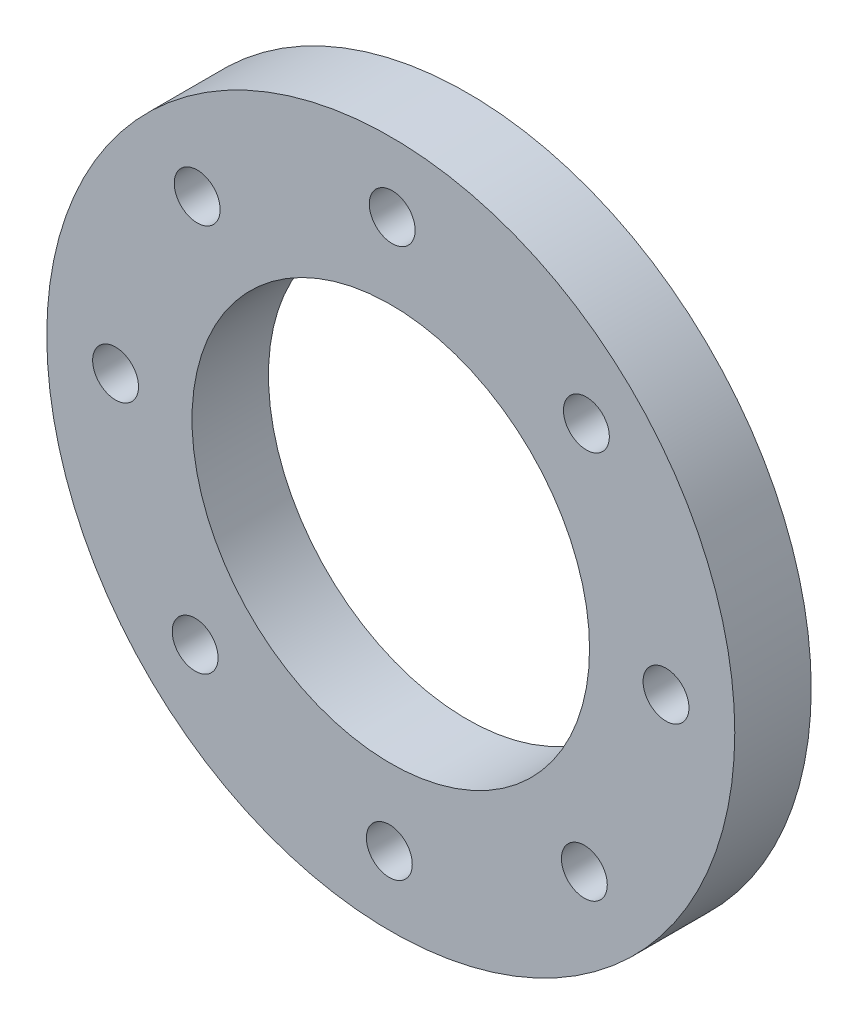
ISO-10303-21;
HEADER;
FILE_DESCRIPTION(('STEP AP214'),'2;1');
FILE_NAME('part.step','',(''),(''),'','','');
FILE_SCHEMA(('AUTOMOTIVE_DESIGN { 1 0 10303 214 1 1 1 1 }'));
ENDSEC;
DATA;
#1=APPLICATION_CONTEXT('core data for automotive mechanical design processes');
#2=APPLICATION_PROTOCOL_DEFINITION('international standard','automotive_design',2000,#1);
#3=PRODUCT_CONTEXT('',#1,'mechanical');
#4=PRODUCT('Part','Part','',(#3));
#5=PRODUCT_RELATED_PRODUCT_CATEGORY('part','',(#4));
#6=PRODUCT_DEFINITION_FORMATION('','',#4);
#7=PRODUCT_DEFINITION_CONTEXT('part definition',#1,'design');
#8=PRODUCT_DEFINITION('design','',#6,#7);
#9=PRODUCT_DEFINITION_SHAPE('','',#8);
#10=(LENGTH_UNIT() NAMED_UNIT(*) SI_UNIT(.MILLI.,.METRE.));
#11=(NAMED_UNIT(*) PLANE_ANGLE_UNIT() SI_UNIT($,.RADIAN.));
#12=(NAMED_UNIT(*) SI_UNIT($,.STERADIAN.) SOLID_ANGLE_UNIT());
#13=UNCERTAINTY_MEASURE_WITH_UNIT(LENGTH_MEASURE(1.E-05),#10,'distance_accuracy_value','');
#14=(GEOMETRIC_REPRESENTATION_CONTEXT(3) GLOBAL_UNCERTAINTY_ASSIGNED_CONTEXT((#13)) GLOBAL_UNIT_ASSIGNED_CONTEXT((#10,
#11,#12)) REPRESENTATION_CONTEXT('',''));
#15=CARTESIAN_POINT('',(0.,0.,0.));
#16=DIRECTION('',(0.,0.,1.));
#17=DIRECTION('',(1.,0.,0.));
#18=AXIS2_PLACEMENT_3D('',#15,#16,#17);
#19=CARTESIAN_POINT('',(0.,0.,5.));
#20=DIRECTION('',(0.,0.,1.));
#21=DIRECTION('',(1.,0.,0.));
#22=AXIS2_PLACEMENT_3D('',#19,#20,#21);
#23=PLANE('',#22);
#24=CARTESIAN_POINT('',(-12.7946172166021,-12.6608755732227,5.));
#25=DIRECTION('',(0.,0.,1.));
#26=DIRECTION('',(1.,0.,0.));
#27=AXIS2_PLACEMENT_3D('',#24,#25,#26);
#28=CIRCLE('',#27,1.5);
#29=CARTESIAN_POINT('',(-11.2946172166021,-12.6608755732227,5.));
#30=VERTEX_POINT('',#29);
#31=EDGE_CURVE('E89',#30,#30,#28,.T.);
#32=ORIENTED_EDGE('',*,*,#31,.F.);
#33=EDGE_LOOP('',(#32));
#34=FACE_BOUND('',#33,.T.);
#35=CARTESIAN_POINT('',(12.6608755732228,-12.7946172166021,5.));
#36=DIRECTION('',(0.,0.,1.));
#37=DIRECTION('',(1.,0.,0.));
#38=AXIS2_PLACEMENT_3D('',#35,#36,#37);
#39=CIRCLE('',#38,1.5);
#40=CARTESIAN_POINT('',(14.1608755732228,-12.7946172166021,5.));
#41=VERTEX_POINT('',#40);
#42=EDGE_CURVE('E77',#41,#41,#39,.T.);
#43=ORIENTED_EDGE('',*,*,#42,.F.);
#44=EDGE_LOOP('',(#43));
#45=FACE_BOUND('',#44,.T.);
#46=CARTESIAN_POINT('',(12.7946172166022,12.6608755732227,5.));
#47=DIRECTION('',(0.,0.,1.));
#48=DIRECTION('',(1.,0.,0.));
#49=AXIS2_PLACEMENT_3D('',#46,#47,#48);
#50=CIRCLE('',#49,1.5);
#51=CARTESIAN_POINT('',(14.2946172166022,12.6608755732227,5.));
#52=VERTEX_POINT('',#51);
#53=EDGE_CURVE('E65',#52,#52,#50,.T.);
#54=ORIENTED_EDGE('',*,*,#53,.F.);
#55=EDGE_LOOP('',(#54));
#56=FACE_BOUND('',#55,.T.);
#57=CARTESIAN_POINT('',(-12.6608755732229,12.794617216602,5.));
#58=DIRECTION('',(0.,0.,1.));
#59=DIRECTION('',(1.,0.,0.));
#60=AXIS2_PLACEMENT_3D('',#57,#58,#59);
#61=CIRCLE('',#60,1.5);
#62=CARTESIAN_POINT('',(-11.1608755732229,12.794617216602,5.));
#63=VERTEX_POINT('',#62);
#64=EDGE_CURVE('E53',#63,#63,#61,.T.);
#65=ORIENTED_EDGE('',*,*,#64,.F.);
#66=EDGE_LOOP('',(#65));
#67=FACE_BOUND('',#66,.T.);
#68=CARTESIAN_POINT('',(0.,0.,5.));
#69=DIRECTION('',(0.,0.,1.));
#70=DIRECTION('',(1.,0.,0.));
#71=AXIS2_PLACEMENT_3D('',#68,#69,#70);
#72=CIRCLE('',#71,22.5);
#73=CARTESIAN_POINT('',(22.5,0.,5.));
#74=VERTEX_POINT('',#73);
#75=EDGE_CURVE('E10',#74,#74,#72,.T.);
#76=ORIENTED_EDGE('',*,*,#75,.T.);
#77=EDGE_LOOP('',(#76));
#78=FACE_BOUND('',#77,.T.);
#79=CARTESIAN_POINT('',(0.,0.,5.));
#80=DIRECTION('',(0.,0.,1.));
#81=DIRECTION('',(1.,0.,0.));
#82=AXIS2_PLACEMENT_3D('',#79,#80,#81);
#83=CIRCLE('',#82,13.);
#84=CARTESIAN_POINT('',(13.,0.,5.));
#85=VERTEX_POINT('',#84);
#86=EDGE_CURVE('E48',#85,#85,#83,.T.);
#87=ORIENTED_EDGE('',*,*,#86,.F.);
#88=EDGE_LOOP('',(#87));
#89=FACE_BOUND('',#88,.T.);
#90=CARTESIAN_POINT('',(0.0945696229606875,17.9997515701304,5.));
#91=DIRECTION('',(0.,0.,1.));
#92=DIRECTION('',(1.,0.,0.));
#93=AXIS2_PLACEMENT_3D('',#90,#91,#92);
#94=CIRCLE('',#93,1.5);
#95=CARTESIAN_POINT('',(1.59456962296069,17.9997515701304,5.));
#96=VERTEX_POINT('',#95);
#97=EDGE_CURVE('E59',#96,#96,#94,.T.);
#98=ORIENTED_EDGE('',*,*,#97,.F.);
#99=EDGE_LOOP('',(#98));
#100=FACE_BOUND('',#99,.T.);
#101=CARTESIAN_POINT('',(17.9997515701304,-0.0945696229605018,5.));
#102=DIRECTION('',(0.,0.,1.));
#103=DIRECTION('',(1.,0.,0.));
#104=AXIS2_PLACEMENT_3D('',#101,#102,#103);
#105=CIRCLE('',#104,1.5);
#106=CARTESIAN_POINT('',(19.4997515701304,-0.0945696229605018,5.));
#107=VERTEX_POINT('',#106);
#108=EDGE_CURVE('E71',#107,#107,#105,.T.);
#109=ORIENTED_EDGE('',*,*,#108,.F.);
#110=EDGE_LOOP('',(#109));
#111=FACE_BOUND('',#110,.T.);
#112=CARTESIAN_POINT('',(-0.0945696229605608,-17.9997515701304,5.));
#113=DIRECTION('',(0.,0.,1.));
#114=DIRECTION('',(1.,0.,0.));
#115=AXIS2_PLACEMENT_3D('',#112,#113,#114);
#116=CIRCLE('',#115,1.5);
#117=CARTESIAN_POINT('',(1.40543037703944,-17.9997515701304,5.));
#118=VERTEX_POINT('',#117);
#119=EDGE_CURVE('E83',#118,#118,#116,.T.);
#120=ORIENTED_EDGE('',*,*,#119,.F.);
#121=EDGE_LOOP('',(#120));
#122=FACE_BOUND('',#121,.T.);
#123=CARTESIAN_POINT('',(-17.9997515701304,0.0945696229606233,5.));
#124=DIRECTION('',(0.,0.,1.));
#125=DIRECTION('',(1.,0.,0.));
#126=AXIS2_PLACEMENT_3D('',#123,#124,#125);
#127=CIRCLE('',#126,1.5);
#128=CARTESIAN_POINT('',(-16.4997515701304,0.0945696229606233,5.));
#129=VERTEX_POINT('',#128);
#130=EDGE_CURVE('E95',#129,#129,#127,.T.);
#131=ORIENTED_EDGE('',*,*,#130,.F.);
#132=EDGE_LOOP('',(#131));
#133=FACE_BOUND('',#132,.T.);
#134=ADVANCED_FACE('F37',(#34,#45,#56,#67,#78,#89,#100,#111,#122,#133),#23,.T.);
#135=CARTESIAN_POINT('',(0.,0.,0.));
#136=DIRECTION('',(0.,0.,1.));
#137=DIRECTION('',(1.,0.,0.));
#138=AXIS2_PLACEMENT_3D('',#135,#136,#137);
#139=PLANE('',#138);
#140=CARTESIAN_POINT('',(0.,0.,0.));
#141=DIRECTION('',(0.,0.,1.));
#142=DIRECTION('',(1.,0.,0.));
#143=AXIS2_PLACEMENT_3D('',#140,#141,#142);
#144=CIRCLE('',#143,22.5);
#145=CARTESIAN_POINT('',(22.5,0.,0.));
#146=VERTEX_POINT('',#145);
#147=EDGE_CURVE('E41',#146,#146,#144,.T.);
#148=ORIENTED_EDGE('',*,*,#147,.F.);
#149=EDGE_LOOP('',(#148));
#150=FACE_BOUND('',#149,.T.);
#151=CARTESIAN_POINT('',(0.,0.,0.));
#152=DIRECTION('',(0.,0.,1.));
#153=DIRECTION('',(1.,0.,0.));
#154=AXIS2_PLACEMENT_3D('',#151,#152,#153);
#155=CIRCLE('',#154,13.);
#156=CARTESIAN_POINT('',(13.,0.,0.));
#157=VERTEX_POINT('',#156);
#158=EDGE_CURVE('E50',#157,#157,#155,.T.);
#159=ORIENTED_EDGE('',*,*,#158,.T.);
#160=EDGE_LOOP('',(#159));
#161=FACE_BOUND('',#160,.T.);
#162=CARTESIAN_POINT('',(-12.6608755732229,12.794617216602,0.));
#163=DIRECTION('',(0.,0.,1.));
#164=DIRECTION('',(1.,0.,0.));
#165=AXIS2_PLACEMENT_3D('',#162,#163,#164);
#166=CIRCLE('',#165,1.5);
#167=CARTESIAN_POINT('',(-11.1608755732229,12.794617216602,0.));
#168=VERTEX_POINT('',#167);
#169=EDGE_CURVE('E56',#168,#168,#166,.T.);
#170=ORIENTED_EDGE('',*,*,#169,.T.);
#171=EDGE_LOOP('',(#170));
#172=FACE_BOUND('',#171,.T.);
#173=CARTESIAN_POINT('',(0.0945696229606875,17.9997515701304,0.));
#174=DIRECTION('',(0.,0.,1.));
#175=DIRECTION('',(1.,0.,0.));
#176=AXIS2_PLACEMENT_3D('',#173,#174,#175);
#177=CIRCLE('',#176,1.5);
#178=CARTESIAN_POINT('',(1.59456962296069,17.9997515701304,0.));
#179=VERTEX_POINT('',#178);
#180=EDGE_CURVE('E62',#179,#179,#177,.T.);
#181=ORIENTED_EDGE('',*,*,#180,.T.);
#182=EDGE_LOOP('',(#181));
#183=FACE_BOUND('',#182,.T.);
#184=CARTESIAN_POINT('',(12.7946172166022,12.6608755732227,0.));
#185=DIRECTION('',(0.,0.,1.));
#186=DIRECTION('',(1.,0.,0.));
#187=AXIS2_PLACEMENT_3D('',#184,#185,#186);
#188=CIRCLE('',#187,1.5);
#189=CARTESIAN_POINT('',(14.2946172166022,12.6608755732227,0.));
#190=VERTEX_POINT('',#189);
#191=EDGE_CURVE('E68',#190,#190,#188,.T.);
#192=ORIENTED_EDGE('',*,*,#191,.T.);
#193=EDGE_LOOP('',(#192));
#194=FACE_BOUND('',#193,.T.);
#195=CARTESIAN_POINT('',(17.9997515701304,-0.0945696229605018,0.));
#196=DIRECTION('',(0.,0.,1.));
#197=DIRECTION('',(1.,0.,0.));
#198=AXIS2_PLACEMENT_3D('',#195,#196,#197);
#199=CIRCLE('',#198,1.5);
#200=CARTESIAN_POINT('',(19.4997515701304,-0.0945696229605018,0.));
#201=VERTEX_POINT('',#200);
#202=EDGE_CURVE('E74',#201,#201,#199,.T.);
#203=ORIENTED_EDGE('',*,*,#202,.T.);
#204=EDGE_LOOP('',(#203));
#205=FACE_BOUND('',#204,.T.);
#206=CARTESIAN_POINT('',(12.6608755732228,-12.7946172166021,0.));
#207=DIRECTION('',(0.,0.,1.));
#208=DIRECTION('',(1.,0.,0.));
#209=AXIS2_PLACEMENT_3D('',#206,#207,#208);
#210=CIRCLE('',#209,1.5);
#211=CARTESIAN_POINT('',(14.1608755732228,-12.7946172166021,0.));
#212=VERTEX_POINT('',#211);
#213=EDGE_CURVE('E80',#212,#212,#210,.T.);
#214=ORIENTED_EDGE('',*,*,#213,.T.);
#215=EDGE_LOOP('',(#214));
#216=FACE_BOUND('',#215,.T.);
#217=CARTESIAN_POINT('',(-0.0945696229605608,-17.9997515701304,0.));
#218=DIRECTION('',(0.,0.,1.));
#219=DIRECTION('',(1.,0.,0.));
#220=AXIS2_PLACEMENT_3D('',#217,#218,#219);
#221=CIRCLE('',#220,1.5);
#222=CARTESIAN_POINT('',(1.40543037703944,-17.9997515701304,0.));
#223=VERTEX_POINT('',#222);
#224=EDGE_CURVE('E86',#223,#223,#221,.T.);
#225=ORIENTED_EDGE('',*,*,#224,.T.);
#226=EDGE_LOOP('',(#225));
#227=FACE_BOUND('',#226,.T.);
#228=CARTESIAN_POINT('',(-12.7946172166021,-12.6608755732227,0.));
#229=DIRECTION('',(0.,0.,1.));
#230=DIRECTION('',(1.,0.,0.));
#231=AXIS2_PLACEMENT_3D('',#228,#229,#230);
#232=CIRCLE('',#231,1.5);
#233=CARTESIAN_POINT('',(-11.2946172166021,-12.6608755732227,0.));
#234=VERTEX_POINT('',#233);
#235=EDGE_CURVE('E92',#234,#234,#232,.T.);
#236=ORIENTED_EDGE('',*,*,#235,.T.);
#237=EDGE_LOOP('',(#236));
#238=FACE_BOUND('',#237,.T.);
#239=CARTESIAN_POINT('',(-17.9997515701304,0.0945696229606233,0.));
#240=DIRECTION('',(0.,0.,1.));
#241=DIRECTION('',(1.,0.,0.));
#242=AXIS2_PLACEMENT_3D('',#239,#240,#241);
#243=CIRCLE('',#242,1.5);
#244=CARTESIAN_POINT('',(-16.4997515701304,0.0945696229606233,0.));
#245=VERTEX_POINT('',#244);
#246=EDGE_CURVE('E98',#245,#245,#243,.T.);
#247=ORIENTED_EDGE('',*,*,#246,.T.);
#248=EDGE_LOOP('',(#247));
#249=FACE_BOUND('',#248,.T.);
#250=ADVANCED_FACE('F108',(#150,#161,#172,#183,#194,#205,#216,#227,#238,#249),#139,.F.);
#251=CARTESIAN_POINT('',(0.,0.,5.));
#252=DIRECTION('',(0.,0.,-1.));
#253=DIRECTION('',(-1.,0.,0.));
#254=AXIS2_PLACEMENT_3D('',#251,#252,#253);
#255=CYLINDRICAL_SURFACE('',#254,22.5);
#256=ORIENTED_EDGE('',*,*,#75,.F.);
#257=EDGE_LOOP('',(#256));
#258=FACE_BOUND('',#257,.T.);
#259=ORIENTED_EDGE('',*,*,#147,.T.);
#260=EDGE_LOOP('',(#259));
#261=FACE_BOUND('',#260,.T.);
#262=ADVANCED_FACE('F39',(#258,#261),#255,.T.);
#263=CARTESIAN_POINT('',(0.,0.,5.));
#264=DIRECTION('',(0.,0.,-1.));
#265=DIRECTION('',(-1.,0.,0.));
#266=AXIS2_PLACEMENT_3D('',#263,#264,#265);
#267=CYLINDRICAL_SURFACE('',#266,13.);
#268=ORIENTED_EDGE('',*,*,#86,.T.);
#269=EDGE_LOOP('',(#268));
#270=FACE_BOUND('',#269,.T.);
#271=ORIENTED_EDGE('',*,*,#158,.F.);
#272=EDGE_LOOP('',(#271));
#273=FACE_BOUND('',#272,.T.);
#274=ADVANCED_FACE('F118',(#270,#273),#267,.F.);
#275=CARTESIAN_POINT('',(-12.6608755732229,12.794617216602,5.));
#276=DIRECTION('',(0.,0.,-1.));
#277=DIRECTION('',(-1.,0.,0.));
#278=AXIS2_PLACEMENT_3D('',#275,#276,#277);
#279=CYLINDRICAL_SURFACE('',#278,1.5);
#280=ORIENTED_EDGE('',*,*,#64,.T.);
#281=EDGE_LOOP('',(#280));
#282=FACE_BOUND('',#281,.T.);
#283=ORIENTED_EDGE('',*,*,#169,.F.);
#284=EDGE_LOOP('',(#283));
#285=FACE_BOUND('',#284,.T.);
#286=ADVANCED_FACE('F121',(#282,#285),#279,.F.);
#287=CARTESIAN_POINT('',(0.0945696229606875,17.9997515701304,5.));
#288=DIRECTION('',(0.,0.,-1.));
#289=DIRECTION('',(-1.,0.,0.));
#290=AXIS2_PLACEMENT_3D('',#287,#288,#289);
#291=CYLINDRICAL_SURFACE('',#290,1.5);
#292=ORIENTED_EDGE('',*,*,#97,.T.);
#293=EDGE_LOOP('',(#292));
#294=FACE_BOUND('',#293,.T.);
#295=ORIENTED_EDGE('',*,*,#180,.F.);
#296=EDGE_LOOP('',(#295));
#297=FACE_BOUND('',#296,.T.);
#298=ADVANCED_FACE('F125',(#294,#297),#291,.F.);
#299=CARTESIAN_POINT('',(12.7946172166022,12.6608755732227,5.));
#300=DIRECTION('',(0.,0.,-1.));
#301=DIRECTION('',(-1.,0.,0.));
#302=AXIS2_PLACEMENT_3D('',#299,#300,#301);
#303=CYLINDRICAL_SURFACE('',#302,1.5);
#304=ORIENTED_EDGE('',*,*,#53,.T.);
#305=EDGE_LOOP('',(#304));
#306=FACE_BOUND('',#305,.T.);
#307=ORIENTED_EDGE('',*,*,#191,.F.);
#308=EDGE_LOOP('',(#307));
#309=FACE_BOUND('',#308,.T.);
#310=ADVANCED_FACE('F129',(#306,#309),#303,.F.);
#311=CARTESIAN_POINT('',(17.9997515701304,-0.0945696229605018,5.));
#312=DIRECTION('',(0.,0.,-1.));
#313=DIRECTION('',(-1.,0.,0.));
#314=AXIS2_PLACEMENT_3D('',#311,#312,#313);
#315=CYLINDRICAL_SURFACE('',#314,1.5);
#316=ORIENTED_EDGE('',*,*,#108,.T.);
#317=EDGE_LOOP('',(#316));
#318=FACE_BOUND('',#317,.T.);
#319=ORIENTED_EDGE('',*,*,#202,.F.);
#320=EDGE_LOOP('',(#319));
#321=FACE_BOUND('',#320,.T.);
#322=ADVANCED_FACE('F133',(#318,#321),#315,.F.);
#323=CARTESIAN_POINT('',(12.6608755732228,-12.7946172166021,5.));
#324=DIRECTION('',(0.,0.,-1.));
#325=DIRECTION('',(-1.,0.,0.));
#326=AXIS2_PLACEMENT_3D('',#323,#324,#325);
#327=CYLINDRICAL_SURFACE('',#326,1.5);
#328=ORIENTED_EDGE('',*,*,#42,.T.);
#329=EDGE_LOOP('',(#328));
#330=FACE_BOUND('',#329,.T.);
#331=ORIENTED_EDGE('',*,*,#213,.F.);
#332=EDGE_LOOP('',(#331));
#333=FACE_BOUND('',#332,.T.);
#334=ADVANCED_FACE('F137',(#330,#333),#327,.F.);
#335=CARTESIAN_POINT('',(-0.0945696229605608,-17.9997515701304,5.));
#336=DIRECTION('',(0.,0.,-1.));
#337=DIRECTION('',(-1.,0.,0.));
#338=AXIS2_PLACEMENT_3D('',#335,#336,#337);
#339=CYLINDRICAL_SURFACE('',#338,1.5);
#340=ORIENTED_EDGE('',*,*,#119,.T.);
#341=EDGE_LOOP('',(#340));
#342=FACE_BOUND('',#341,.T.);
#343=ORIENTED_EDGE('',*,*,#224,.F.);
#344=EDGE_LOOP('',(#343));
#345=FACE_BOUND('',#344,.T.);
#346=ADVANCED_FACE('F141',(#342,#345),#339,.F.);
#347=CARTESIAN_POINT('',(-12.7946172166021,-12.6608755732227,5.));
#348=DIRECTION('',(0.,0.,-1.));
#349=DIRECTION('',(-1.,0.,0.));
#350=AXIS2_PLACEMENT_3D('',#347,#348,#349);
#351=CYLINDRICAL_SURFACE('',#350,1.5);
#352=ORIENTED_EDGE('',*,*,#31,.T.);
#353=EDGE_LOOP('',(#352));
#354=FACE_BOUND('',#353,.T.);
#355=ORIENTED_EDGE('',*,*,#235,.F.);
#356=EDGE_LOOP('',(#355));
#357=FACE_BOUND('',#356,.T.);
#358=ADVANCED_FACE('F145',(#354,#357),#351,.F.);
#359=CARTESIAN_POINT('',(-17.9997515701304,0.0945696229606233,5.));
#360=DIRECTION('',(0.,0.,-1.));
#361=DIRECTION('',(-1.,0.,0.));
#362=AXIS2_PLACEMENT_3D('',#359,#360,#361);
#363=CYLINDRICAL_SURFACE('',#362,1.5);
#364=ORIENTED_EDGE('',*,*,#130,.T.);
#365=EDGE_LOOP('',(#364));
#366=FACE_BOUND('',#365,.T.);
#367=ORIENTED_EDGE('',*,*,#246,.F.);
#368=EDGE_LOOP('',(#367));
#369=FACE_BOUND('',#368,.T.);
#370=ADVANCED_FACE('F104',(#366,#369),#363,.F.);
#371=CLOSED_SHELL('',(#134,#250,#262,#274,#286,#298,#310,#322,#334,#346,#358,#370));
#372=MANIFOLD_SOLID_BREP('B2',#371);
#373=ADVANCED_BREP_SHAPE_REPRESENTATION('',(#18,#372),#14);
#374=SHAPE_DEFINITION_REPRESENTATION(#9,#373);
ENDSEC;
END-ISO-10303-21;
